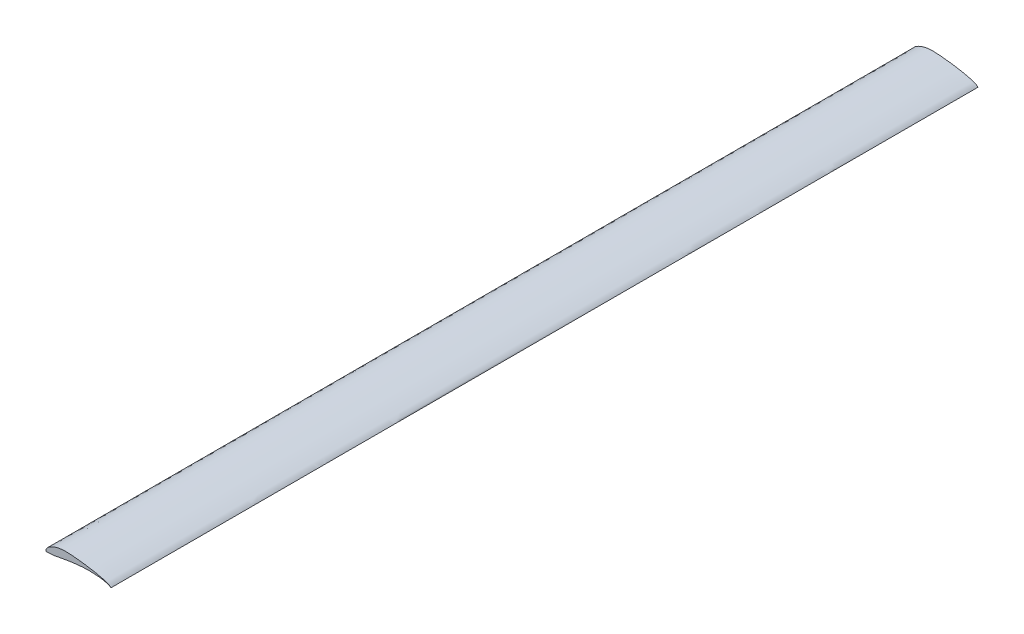
ISO-10303-21;
HEADER;
FILE_DESCRIPTION(('STEP AP214'),'2;1');
FILE_NAME('part.step','',(''),(''),'','','');
FILE_SCHEMA(('AUTOMOTIVE_DESIGN { 1 0 10303 214 1 1 1 1 }'));
ENDSEC;
DATA;
#1=APPLICATION_CONTEXT('core data for automotive mechanical design processes');
#2=APPLICATION_PROTOCOL_DEFINITION('international standard','automotive_design',2000,#1);
#3=PRODUCT_CONTEXT('',#1,'mechanical');
#4=PRODUCT('Part','Part','',(#3));
#5=PRODUCT_RELATED_PRODUCT_CATEGORY('part','',(#4));
#6=PRODUCT_DEFINITION_FORMATION('','',#4);
#7=PRODUCT_DEFINITION_CONTEXT('part definition',#1,'design');
#8=PRODUCT_DEFINITION('design','',#6,#7);
#9=PRODUCT_DEFINITION_SHAPE('','',#8);
#10=(LENGTH_UNIT() NAMED_UNIT(*) SI_UNIT(.MILLI.,.METRE.));
#11=(NAMED_UNIT(*) PLANE_ANGLE_UNIT() SI_UNIT($,.RADIAN.));
#12=(NAMED_UNIT(*) SI_UNIT($,.STERADIAN.) SOLID_ANGLE_UNIT());
#13=UNCERTAINTY_MEASURE_WITH_UNIT(LENGTH_MEASURE(1.E-05),#10,'distance_accuracy_value','');
#14=(GEOMETRIC_REPRESENTATION_CONTEXT(3) GLOBAL_UNCERTAINTY_ASSIGNED_CONTEXT((#13)) GLOBAL_UNIT_ASSIGNED_CONTEXT((#10,
#11,#12)) REPRESENTATION_CONTEXT('',''));
#15=CARTESIAN_POINT('',(0.,0.,0.));
#16=DIRECTION('',(0.,0.,1.));
#17=DIRECTION('',(1.,0.,0.));
#18=AXIS2_PLACEMENT_3D('',#15,#16,#17);
#19=CARTESIAN_POINT('',(300.,0.,-2000.));
#20=CARTESIAN_POINT('',(300.001795983605,0.00763715859673222,-2000.));
#21=CARTESIAN_POINT('',(299.015585752293,0.742430957016468,-2000.));
#22=CARTESIAN_POINT('',(298.18152562803,1.56078842937956,-2000.));
#23=CARTESIAN_POINT('',(296.329575234037,3.27008916976382,-2000.));
#24=CARTESIAN_POINT('',(294.144706764707,5.0884583095431,-2000.));
#25=CARTESIAN_POINT('',(291.155994363023,6.92157672173298,-2000.));
#26=CARTESIAN_POINT('',(287.439507775139,8.69807569772041,-2000.));
#27=CARTESIAN_POINT('',(282.952833808067,10.5520675552807,-2000.));
#28=CARTESIAN_POINT('',(277.70281147001,12.4577371748726,-2000.));
#29=CARTESIAN_POINT('',(271.713933682686,14.4016224154794,-2000.));
#30=CARTESIAN_POINT('',(265.017290800352,16.3668457199447,-2000.));
#31=CARTESIAN_POINT('',(257.650382156373,18.3441832740386,-2000.));
#32=CARTESIAN_POINT('',(249.653884636791,20.3154793423295,-2000.));
#33=CARTESIAN_POINT('',(241.073644248825,22.2664638070432,-2000.));
#34=CARTESIAN_POINT('',(231.960801340349,24.1849508322761,-2000.));
#35=CARTESIAN_POINT('',(222.371003157008,26.0610779286231,-2000.));
#36=CARTESIAN_POINT('',(212.360297763384,27.8717582447534,-2000.));
#37=CARTESIAN_POINT('',(201.991724453508,29.6144048371232,-2000.));
#38=CARTESIAN_POINT('',(191.325038141527,31.2665777805945,-2000.));
#39=CARTESIAN_POINT('',(180.429220564025,32.8315032661116,-2000.));
#40=CARTESIAN_POINT('',(169.374100905629,34.2967800398173,-2000.));
#41=CARTESIAN_POINT('',(158.239751449208,35.6577192962709,-2000.));
#42=CARTESIAN_POINT('',(147.115182873154,36.9239572232639,-2000.));
#43=CARTESIAN_POINT('',(136.092490036449,38.0635433672868,-2000.));
#44=CARTESIAN_POINT('',(125.261473129852,39.0551490782376,-2000.));
#45=CARTESIAN_POINT('',(114.6983086741,39.8429613709512,-2000.));
#46=CARTESIAN_POINT('',(104.463337343177,40.3848751165421,-2000.));
#47=CARTESIAN_POINT('',(94.6134996280755,40.6188987214346,-2000.));
#48=CARTESIAN_POINT('',(85.1992548468994,40.593988437639,-2000.));
#49=CARTESIAN_POINT('',(76.238164207972,40.1330394875528,-2000.));
#50=CARTESIAN_POINT('',(67.7267564297545,39.1989472050794,-2000.));
#51=CARTESIAN_POINT('',(59.630383475345,37.8781268654649,-2000.));
#52=CARTESIAN_POINT('',(51.9470912780076,36.1670157756287,-2000.));
#53=CARTESIAN_POINT('',(44.6847732999355,34.1604993352668,-2000.));
#54=CARTESIAN_POINT('',(37.8741573058014,31.8941160226687,-2000.));
#55=CARTESIAN_POINT('',(31.5442082173634,29.4208652931633,-2000.));
#56=CARTESIAN_POINT('',(25.7342610796364,26.7539979155627,-2000.));
#57=CARTESIAN_POINT('',(20.4629481170504,23.9476589696708,-2000.));
#58=CARTESIAN_POINT('',(15.7589470041091,21.0337619503612,-2000.));
#59=CARTESIAN_POINT('',(11.6517570180599,18.0517926895371,-2000.));
#60=CARTESIAN_POINT('',(8.14307278152673,15.064957634488,-2000.));
#61=CARTESIAN_POINT('',(5.28377638066302,12.0406532359922,-2000.));
#62=CARTESIAN_POINT('',(3.0874720357416,9.00507003509979,-2000.));
#63=CARTESIAN_POINT('',(1.46511733224297,6.0518518458769,-2000.));
#64=CARTESIAN_POINT('',(0.42535965824416,3.2479110940409,-2000.));
#65=CARTESIAN_POINT('',(-0.0700849238185995,0.659874628251156,-2000.));
#66=CARTESIAN_POINT('',(0.0255492887644001,-1.5289907883929,-2000.));
#67=CARTESIAN_POINT('',(0.589081224804618,-3.53653307987806,-2000.));
#68=CARTESIAN_POINT('',(2.68381966693403,-4.53309178028155,-2000.));
#69=CARTESIAN_POINT('',(5.50022300769823,-4.67290582740109,-2000.));
#70=CARTESIAN_POINT('',(9.35305227753905,-4.80841415171953,-2000.));
#71=CARTESIAN_POINT('',(14.198257000059,-4.59947875010366,-2000.));
#72=CARTESIAN_POINT('',(19.9810767909202,-4.21551915435351,-2000.));
#73=CARTESIAN_POINT('',(26.6371549022216,-3.60049914188147,-2000.));
#74=CARTESIAN_POINT('',(34.0983812095756,-2.76835062166525,-2000.));
#75=CARTESIAN_POINT('',(42.3283728129882,-1.70121718761063,-2000.));
#76=CARTESIAN_POINT('',(51.3231078369777,-0.209739429087208,-2000.));
#77=CARTESIAN_POINT('',(61.1263808747076,1.66054950372669,-2000.));
#78=CARTESIAN_POINT('',(71.7872016925286,3.69602068802822,-2000.));
#79=CARTESIAN_POINT('',(83.25346106813,5.84518644024819,-2000.));
#80=CARTESIAN_POINT('',(95.4531388332403,8.01884175016413,-2000.));
#81=CARTESIAN_POINT('',(108.296640117714,10.1354118831993,-2000.));
#82=CARTESIAN_POINT('',(121.684324146165,12.1242190239294,-2000.));
#83=CARTESIAN_POINT('',(135.500816474852,13.9123065726971,-2000.));
#84=CARTESIAN_POINT('',(149.621869257262,15.4476097347776,-2000.));
#85=CARTESIAN_POINT('',(163.914090851251,16.6612036678384,-2000.));
#86=CARTESIAN_POINT('',(178.234055290892,17.521492123788,-2000.));
#87=CARTESIAN_POINT('',(192.432155706654,17.9944403394851,-2000.));
#88=CARTESIAN_POINT('',(206.354367624125,18.0541770878253,-2000.));
#89=CARTESIAN_POINT('',(219.845366964697,17.6966435356442,-2000.));
#90=CARTESIAN_POINT('',(232.750673793726,16.9302096130688,-2000.));
#91=CARTESIAN_POINT('',(244.91510362389,15.764764381612,-2000.));
#92=CARTESIAN_POINT('',(256.193831634682,14.245043325413,-2000.));
#93=CARTESIAN_POINT('',(266.440012399119,12.415143021236,-2000.));
#94=CARTESIAN_POINT('',(275.533513984769,10.3363490979766,-2000.));
#95=CARTESIAN_POINT('',(283.306747334447,8.11194698993702,-2000.));
#96=CARTESIAN_POINT('',(289.668337182173,5.73787302688496,-2000.));
#97=CARTESIAN_POINT('',(294.207167781948,3.56529140900345,-2000.));
#98=CARTESIAN_POINT('',(297.553526415869,1.55644946963759,-2000.));
#99=CARTESIAN_POINT('',(298.839053504644,0.779060777800024,-2000.));
#100=CARTESIAN_POINT('',(299.998167504211,-0.00779242134052216,-2000.));
#101=CARTESIAN_POINT('',(300.,0.,-2000.));
#102=B_SPLINE_CURVE_WITH_KNOTS('',3,(#19,#20,#21,#22,#23,#24,#25,#26,#27,#28,#29,#30,#31,#32,
#33,#34,#35,#36,#37,#38,#39,#40,#41,#42,#43,#44,#45,#46,#47,#48,#49,#50,#51,#52,#53,#54,#55,#56,
#57,#58,#59,#60,#61,#62,#63,#64,#65,#66,#67,#68,#69,#70,#71,#72,#73,#74,#75,#76,#77,#78,#79,#80,
#81,#82,#83,#84,#85,#86,#87,#88,#89,#90,#91,#92,#93,#94,#95,#96,#97,#98,#99,#100,#101),
.UNSPECIFIED.,.T.,.F.,(4,1,1,1,1,1,1,1,1,1,1,1,1,1,1,1,1,1,1,1,1,1,1,1,1,1,1,1,1,1,1,1,1,1,1,1,
1,1,1,1,1,1,1,1,1,1,1,1,1,1,1,1,1,1,1,1,1,1,1,1,1,1,1,1,1,1,1,1,1,1,1,1,1,1,1,1,1,1,1,1,4),(0.,
0.00097967755713414,0.00364886216776308,0.00748349851947807,0.0120952771855933,
0.0175255907768788,0.0240517799938711,0.0317830505527587,0.0406778280832619,0.0507103007904779,
0.0618332290621794,0.0739892504845854,0.0871181731906812,0.101145048769791,0.115990637111827,
0.131570421640589,0.147788379302961,0.164550916882416,0.181757895150531,0.199311954944345,
0.217095071712264,0.234990228463986,0.252856883122009,0.270540593729572,0.287886779266045,
0.304773437599674,0.321101419214061,0.336806063174811,0.351800032584037,0.366031063392082,
0.379615674919835,0.392652962879186,0.405170358707495,0.417171919049936,0.428603516911185,
0.439418959108259,0.449596586064162,0.459102079103161,0.467907877534646,0.475988300736527,
0.483308968746149,0.489874507816402,0.495803249719207,0.501149411695553,0.50590307325604,
0.510046768536663,0.513579310681042,0.516446926626751,0.5193500525909,0.523823355179486,
0.529973793997694,0.537715654387927,0.546967844488146,0.55763736682571,0.569620481096633,
0.582804124215616,0.597246960791632,0.613135036654701,0.630443600329816,0.649056123608546,
0.668822256795696,0.689594964002684,0.711189650864602,0.733426688964389,0.756094117504156,
0.778988553684861,0.801889682684955,0.824566597829707,0.846792284880412,0.868338290507787,
0.888978162959066,0.908492011340558,0.926658767581933,0.943286193042322,0.958169210358794,
0.971135821634751,0.981955623079976,0.990251791025976,0.995852565249962,0.999000405686701,1.),.UNSPECIFIED.);
#103=DIRECTION('',(0.,0.,1.));
#104=VECTOR('',#103,1.);
#105=SURFACE_OF_LINEAR_EXTRUSION('',#102,#104);
#106=CARTESIAN_POINT('',(300.,0.,-2000.));
#107=VERTEX_POINT('',#106);
#108=EDGE_CURVE('E10',#107,#107,#102,.T.);
#109=ORIENTED_EDGE('',*,*,#108,.T.);
#110=EDGE_LOOP('',(#109));
#111=FACE_BOUND('',#110,.T.);
#112=CARTESIAN_POINT('',(300.,0.,2000.));
#113=CARTESIAN_POINT('',(300.001795983605,0.00763715859673222,2000.));
#114=CARTESIAN_POINT('',(299.015585752293,0.742430957016468,2000.));
#115=CARTESIAN_POINT('',(298.18152562803,1.56078842937956,2000.));
#116=CARTESIAN_POINT('',(296.329575234037,3.27008916976382,2000.));
#117=CARTESIAN_POINT('',(294.144706764707,5.0884583095431,2000.));
#118=CARTESIAN_POINT('',(291.155994363023,6.92157672173298,2000.));
#119=CARTESIAN_POINT('',(287.439507775139,8.69807569772041,2000.));
#120=CARTESIAN_POINT('',(282.952833808067,10.5520675552807,2000.));
#121=CARTESIAN_POINT('',(277.70281147001,12.4577371748726,2000.));
#122=CARTESIAN_POINT('',(271.713933682686,14.4016224154794,2000.));
#123=CARTESIAN_POINT('',(265.017290800352,16.3668457199447,2000.));
#124=CARTESIAN_POINT('',(257.650382156373,18.3441832740386,2000.));
#125=CARTESIAN_POINT('',(249.653884636791,20.3154793423295,2000.));
#126=CARTESIAN_POINT('',(241.073644248825,22.2664638070432,2000.));
#127=CARTESIAN_POINT('',(231.960801340349,24.1849508322761,2000.));
#128=CARTESIAN_POINT('',(222.371003157008,26.0610779286231,2000.));
#129=CARTESIAN_POINT('',(212.360297763384,27.8717582447534,2000.));
#130=CARTESIAN_POINT('',(201.991724453508,29.6144048371232,2000.));
#131=CARTESIAN_POINT('',(191.325038141527,31.2665777805945,2000.));
#132=CARTESIAN_POINT('',(180.429220564025,32.8315032661116,2000.));
#133=CARTESIAN_POINT('',(169.374100905629,34.2967800398173,2000.));
#134=CARTESIAN_POINT('',(158.239751449208,35.6577192962709,2000.));
#135=CARTESIAN_POINT('',(147.115182873154,36.9239572232639,2000.));
#136=CARTESIAN_POINT('',(136.092490036449,38.0635433672868,2000.));
#137=CARTESIAN_POINT('',(125.261473129852,39.0551490782376,2000.));
#138=CARTESIAN_POINT('',(114.6983086741,39.8429613709512,2000.));
#139=CARTESIAN_POINT('',(104.463337343177,40.3848751165421,2000.));
#140=CARTESIAN_POINT('',(94.6134996280755,40.6188987214346,2000.));
#141=CARTESIAN_POINT('',(85.1992548468994,40.593988437639,2000.));
#142=CARTESIAN_POINT('',(76.238164207972,40.1330394875528,2000.));
#143=CARTESIAN_POINT('',(67.7267564297545,39.1989472050794,2000.));
#144=CARTESIAN_POINT('',(59.630383475345,37.8781268654649,2000.));
#145=CARTESIAN_POINT('',(51.9470912780076,36.1670157756287,2000.));
#146=CARTESIAN_POINT('',(44.6847732999355,34.1604993352668,2000.));
#147=CARTESIAN_POINT('',(37.8741573058014,31.8941160226687,2000.));
#148=CARTESIAN_POINT('',(31.5442082173634,29.4208652931633,2000.));
#149=CARTESIAN_POINT('',(25.7342610796364,26.7539979155627,2000.));
#150=CARTESIAN_POINT('',(20.4629481170504,23.9476589696708,2000.));
#151=CARTESIAN_POINT('',(15.7589470041091,21.0337619503612,2000.));
#152=CARTESIAN_POINT('',(11.6517570180599,18.0517926895371,2000.));
#153=CARTESIAN_POINT('',(8.14307278152673,15.064957634488,2000.));
#154=CARTESIAN_POINT('',(5.28377638066302,12.0406532359922,2000.));
#155=CARTESIAN_POINT('',(3.0874720357416,9.00507003509979,2000.));
#156=CARTESIAN_POINT('',(1.46511733224297,6.0518518458769,2000.));
#157=CARTESIAN_POINT('',(0.42535965824416,3.2479110940409,2000.));
#158=CARTESIAN_POINT('',(-0.0700849238185995,0.659874628251156,2000.));
#159=CARTESIAN_POINT('',(0.0255492887644001,-1.5289907883929,2000.));
#160=CARTESIAN_POINT('',(0.589081224804618,-3.53653307987806,2000.));
#161=CARTESIAN_POINT('',(2.68381966693403,-4.53309178028155,2000.));
#162=CARTESIAN_POINT('',(5.50022300769823,-4.67290582740109,2000.));
#163=CARTESIAN_POINT('',(9.35305227753905,-4.80841415171953,2000.));
#164=CARTESIAN_POINT('',(14.198257000059,-4.59947875010366,2000.));
#165=CARTESIAN_POINT('',(19.9810767909202,-4.21551915435351,2000.));
#166=CARTESIAN_POINT('',(26.6371549022216,-3.60049914188147,2000.));
#167=CARTESIAN_POINT('',(34.0983812095756,-2.76835062166525,2000.));
#168=CARTESIAN_POINT('',(42.3283728129882,-1.70121718761063,2000.));
#169=CARTESIAN_POINT('',(51.3231078369777,-0.209739429087208,2000.));
#170=CARTESIAN_POINT('',(61.1263808747076,1.66054950372669,2000.));
#171=CARTESIAN_POINT('',(71.7872016925286,3.69602068802822,2000.));
#172=CARTESIAN_POINT('',(83.25346106813,5.84518644024819,2000.));
#173=CARTESIAN_POINT('',(95.4531388332403,8.01884175016413,2000.));
#174=CARTESIAN_POINT('',(108.296640117714,10.1354118831993,2000.));
#175=CARTESIAN_POINT('',(121.684324146165,12.1242190239294,2000.));
#176=CARTESIAN_POINT('',(135.500816474852,13.9123065726971,2000.));
#177=CARTESIAN_POINT('',(149.621869257262,15.4476097347776,2000.));
#178=CARTESIAN_POINT('',(163.914090851251,16.6612036678384,2000.));
#179=CARTESIAN_POINT('',(178.234055290892,17.521492123788,2000.));
#180=CARTESIAN_POINT('',(192.432155706654,17.9944403394851,2000.));
#181=CARTESIAN_POINT('',(206.354367624125,18.0541770878253,2000.));
#182=CARTESIAN_POINT('',(219.845366964697,17.6966435356442,2000.));
#183=CARTESIAN_POINT('',(232.750673793726,16.9302096130688,2000.));
#184=CARTESIAN_POINT('',(244.91510362389,15.764764381612,2000.));
#185=CARTESIAN_POINT('',(256.193831634682,14.245043325413,2000.));
#186=CARTESIAN_POINT('',(266.440012399119,12.415143021236,2000.));
#187=CARTESIAN_POINT('',(275.533513984769,10.3363490979766,2000.));
#188=CARTESIAN_POINT('',(283.306747334447,8.11194698993702,2000.));
#189=CARTESIAN_POINT('',(289.668337182173,5.73787302688496,2000.));
#190=CARTESIAN_POINT('',(294.207167781948,3.56529140900345,2000.));
#191=CARTESIAN_POINT('',(297.553526415869,1.55644946963759,2000.));
#192=CARTESIAN_POINT('',(298.839053504644,0.779060777800024,2000.));
#193=CARTESIAN_POINT('',(299.998167504211,-0.00779242134052216,2000.));
#194=CARTESIAN_POINT('',(300.,0.,2000.));
#195=B_SPLINE_CURVE_WITH_KNOTS('',3,(#112,#113,#114,#115,#116,#117,#118,#119,#120,#121,#122,
#123,#124,#125,#126,#127,#128,#129,#130,#131,#132,#133,#134,#135,#136,#137,#138,#139,#140,#141,
#142,#143,#144,#145,#146,#147,#148,#149,#150,#151,#152,#153,#154,#155,#156,#157,#158,#159,#160,
#161,#162,#163,#164,#165,#166,#167,#168,#169,#170,#171,#172,#173,#174,#175,#176,#177,#178,#179,
#180,#181,#182,#183,#184,#185,#186,#187,#188,#189,#190,#191,#192,#193,#194),.UNSPECIFIED.,.T.,
.F.,(4,1,1,1,1,1,1,1,1,1,1,1,1,1,1,1,1,1,1,1,1,1,1,1,1,1,1,1,1,1,1,1,1,1,1,1,1,1,1,1,1,1,1,1,1,
1,1,1,1,1,1,1,1,1,1,1,1,1,1,1,1,1,1,1,1,1,1,1,1,1,1,1,1,1,1,1,1,1,1,1,4),(0.,
0.00097967755713414,0.00364886216776308,0.00748349851947807,0.0120952771855933,
0.0175255907768788,0.0240517799938711,0.0317830505527587,0.0406778280832619,0.0507103007904779,
0.0618332290621794,0.0739892504845854,0.0871181731906812,0.101145048769791,0.115990637111827,
0.131570421640589,0.147788379302961,0.164550916882416,0.181757895150531,0.199311954944345,
0.217095071712264,0.234990228463986,0.252856883122009,0.270540593729572,0.287886779266045,
0.304773437599674,0.321101419214061,0.336806063174811,0.351800032584037,0.366031063392082,
0.379615674919835,0.392652962879186,0.405170358707495,0.417171919049936,0.428603516911185,
0.439418959108259,0.449596586064162,0.459102079103161,0.467907877534646,0.475988300736527,
0.483308968746149,0.489874507816402,0.495803249719207,0.501149411695553,0.50590307325604,
0.510046768536663,0.513579310681042,0.516446926626751,0.5193500525909,0.523823355179486,
0.529973793997694,0.537715654387927,0.546967844488146,0.55763736682571,0.569620481096633,
0.582804124215616,0.597246960791632,0.613135036654701,0.630443600329816,0.649056123608546,
0.668822256795696,0.689594964002684,0.711189650864602,0.733426688964389,0.756094117504156,
0.778988553684861,0.801889682684955,0.824566597829707,0.846792284880412,0.868338290507787,
0.888978162959066,0.908492011340558,0.926658767581933,0.943286193042322,0.958169210358794,
0.971135821634751,0.981955623079976,0.990251791025976,0.995852565249962,0.999000405686701,1.),.UNSPECIFIED.);
#196=CARTESIAN_POINT('',(300.,0.,2000.));
#197=VERTEX_POINT('',#196);
#198=EDGE_CURVE('E40',#197,#197,#195,.T.);
#199=ORIENTED_EDGE('',*,*,#198,.F.);
#200=EDGE_LOOP('',(#199));
#201=FACE_BOUND('',#200,.T.);
#202=ADVANCED_FACE('F31',(#111,#201),#105,.T.);
#203=CARTESIAN_POINT('',(1.79334461090265,6.5603953915002,-2000.));
#204=DIRECTION('',(0.,0.,-1.));
#205=DIRECTION('',(-1.,0.,0.));
#206=AXIS2_PLACEMENT_3D('',#203,#204,#205);
#207=PLANE('',#206);
#208=ORIENTED_EDGE('',*,*,#108,.F.);
#209=EDGE_LOOP('',(#208));
#210=FACE_BOUND('',#209,.T.);
#211=ADVANCED_FACE('F54',(#210),#207,.T.);
#212=CARTESIAN_POINT('',(1.79334461090265,6.5603953915002,2000.));
#213=DIRECTION('',(0.,0.,-1.));
#214=DIRECTION('',(-1.,0.,0.));
#215=AXIS2_PLACEMENT_3D('',#212,#213,#214);
#216=PLANE('',#215);
#217=ORIENTED_EDGE('',*,*,#198,.T.);
#218=EDGE_LOOP('',(#217));
#219=FACE_BOUND('',#218,.T.);
#220=ADVANCED_FACE('F51',(#219),#216,.F.);
#221=CLOSED_SHELL('',(#202,#211,#220));
#222=MANIFOLD_SOLID_BREP('B2',#221);
#223=ADVANCED_BREP_SHAPE_REPRESENTATION('',(#18,#222),#14);
#224=SHAPE_DEFINITION_REPRESENTATION(#9,#223);
ENDSEC;
END-ISO-10303-21;
